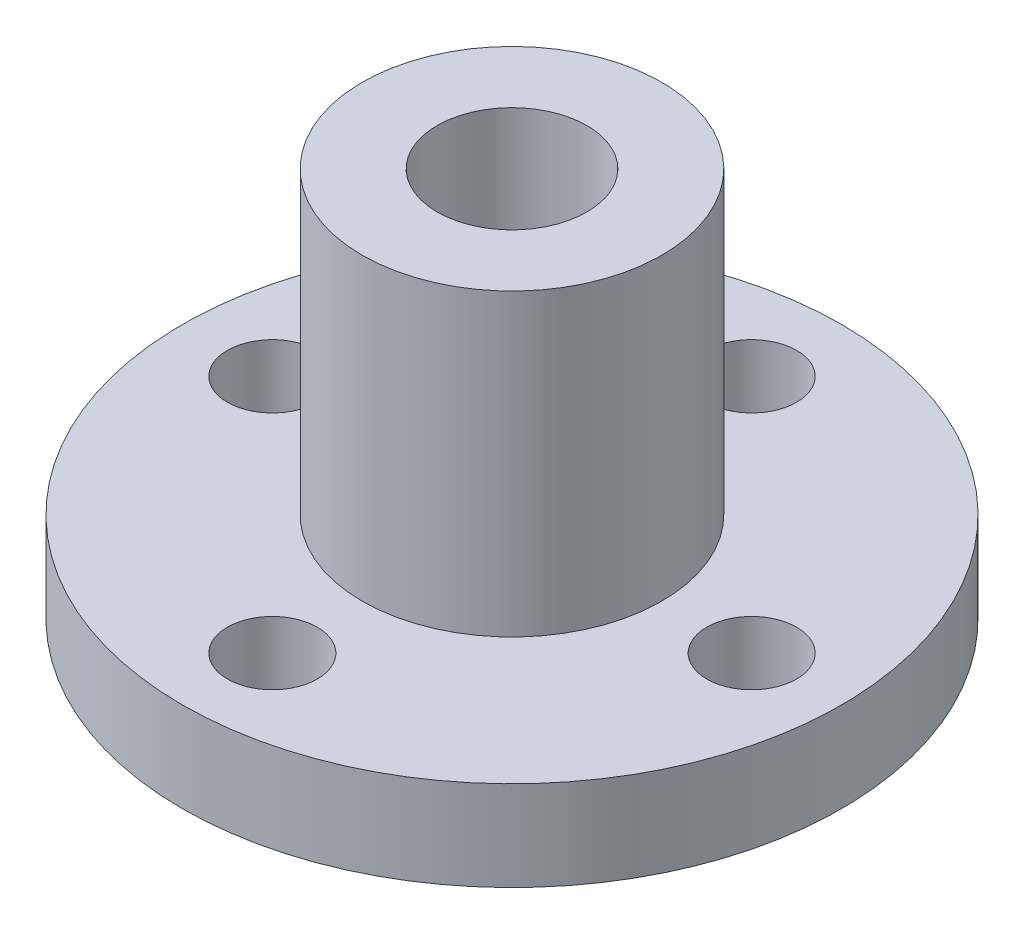
ISO-10303-21;
HEADER;
FILE_DESCRIPTION(('STEP AP214'),'2;1');
FILE_NAME('part.step','',(''),(''),'','','');
FILE_SCHEMA(('AUTOMOTIVE_DESIGN { 1 0 10303 214 1 1 1 1 }'));
ENDSEC;
DATA;
#1=APPLICATION_CONTEXT('core data for automotive mechanical design processes');
#2=APPLICATION_PROTOCOL_DEFINITION('international standard','automotive_design',2000,#1);
#3=PRODUCT_CONTEXT('',#1,'mechanical');
#4=PRODUCT('Part','Part','',(#3));
#5=PRODUCT_RELATED_PRODUCT_CATEGORY('part','',(#4));
#6=PRODUCT_DEFINITION_FORMATION('','',#4);
#7=PRODUCT_DEFINITION_CONTEXT('part definition',#1,'design');
#8=PRODUCT_DEFINITION('design','',#6,#7);
#9=PRODUCT_DEFINITION_SHAPE('','',#8);
#10=(LENGTH_UNIT() NAMED_UNIT(*) SI_UNIT(.MILLI.,.METRE.));
#11=(NAMED_UNIT(*) PLANE_ANGLE_UNIT() SI_UNIT($,.RADIAN.));
#12=(NAMED_UNIT(*) SI_UNIT($,.STERADIAN.) SOLID_ANGLE_UNIT());
#13=UNCERTAINTY_MEASURE_WITH_UNIT(LENGTH_MEASURE(1.E-05),#10,'distance_accuracy_value','');
#14=(GEOMETRIC_REPRESENTATION_CONTEXT(3) GLOBAL_UNCERTAINTY_ASSIGNED_CONTEXT((#13)) GLOBAL_UNIT_ASSIGNED_CONTEXT((#10,
#11,#12)) REPRESENTATION_CONTEXT('',''));
#15=CARTESIAN_POINT('',(0.,0.,0.));
#16=DIRECTION('',(0.,0.,1.));
#17=DIRECTION('',(1.,0.,0.));
#18=AXIS2_PLACEMENT_3D('',#15,#16,#17);
#19=CARTESIAN_POINT('',(0.,3.,0.));
#20=DIRECTION('',(0.,-1.,0.));
#21=DIRECTION('',(0.,0.,-1.));
#22=AXIS2_PLACEMENT_3D('',#19,#20,#21);
#23=CYLINDRICAL_SURFACE('',#22,11.);
#24=CARTESIAN_POINT('',(0.,3.,0.));
#25=DIRECTION('',(0.,1.,0.));
#26=DIRECTION('',(0.,0.,1.));
#27=AXIS2_PLACEMENT_3D('',#24,#25,#26);
#28=CIRCLE('',#27,11.);
#29=CARTESIAN_POINT('',(0.,3.,11.));
#30=VERTEX_POINT('',#29);
#31=EDGE_CURVE('E47',#30,#30,#28,.T.);
#32=ORIENTED_EDGE('',*,*,#31,.F.);
#33=EDGE_LOOP('',(#32));
#34=FACE_BOUND('',#33,.T.);
#35=CARTESIAN_POINT('',(0.,0.,0.));
#36=DIRECTION('',(0.,1.,0.));
#37=DIRECTION('',(0.,0.,1.));
#38=AXIS2_PLACEMENT_3D('',#35,#36,#37);
#39=CIRCLE('',#38,11.);
#40=CARTESIAN_POINT('',(0.,0.,11.));
#41=VERTEX_POINT('',#40);
#42=EDGE_CURVE('E42',#41,#41,#39,.T.);
#43=ORIENTED_EDGE('',*,*,#42,.T.);
#44=EDGE_LOOP('',(#43));
#45=FACE_BOUND('',#44,.T.);
#46=ADVANCED_FACE('F39',(#34,#45),#23,.T.);
#47=CARTESIAN_POINT('',(0.,3.,0.));
#48=DIRECTION('',(0.,1.,0.));
#49=DIRECTION('',(0.,0.,1.));
#50=AXIS2_PLACEMENT_3D('',#47,#48,#49);
#51=PLANE('',#50);
#52=CARTESIAN_POINT('',(-8.,3.,0.));
#53=DIRECTION('',(0.,1.,0.));
#54=DIRECTION('',(0.,0.,1.));
#55=AXIS2_PLACEMENT_3D('',#52,#53,#54);
#56=CIRCLE('',#55,1.5);
#57=CARTESIAN_POINT('',(-8.,3.,1.5));
#58=VERTEX_POINT('',#57);
#59=EDGE_CURVE('E66',#58,#58,#56,.F.);
#60=ORIENTED_EDGE('',*,*,#59,.T.);
#61=EDGE_LOOP('',(#60));
#62=FACE_BOUND('',#61,.T.);
#63=CARTESIAN_POINT('',(0.,3.,8.));
#64=DIRECTION('',(0.,1.,0.));
#65=DIRECTION('',(0.,0.,1.));
#66=AXIS2_PLACEMENT_3D('',#63,#64,#65);
#67=CIRCLE('',#66,1.5);
#68=CARTESIAN_POINT('',(0.,3.,9.5));
#69=VERTEX_POINT('',#68);
#70=EDGE_CURVE('E80',#69,#69,#67,.F.);
#71=ORIENTED_EDGE('',*,*,#70,.T.);
#72=EDGE_LOOP('',(#71));
#73=FACE_BOUND('',#72,.T.);
#74=CARTESIAN_POINT('',(8.,3.,0.));
#75=DIRECTION('',(0.,1.,0.));
#76=DIRECTION('',(0.,0.,1.));
#77=AXIS2_PLACEMENT_3D('',#74,#75,#76);
#78=CIRCLE('',#77,1.5);
#79=CARTESIAN_POINT('',(8.,3.,1.5));
#80=VERTEX_POINT('',#79);
#81=EDGE_CURVE('E71',#80,#80,#78,.F.);
#82=ORIENTED_EDGE('',*,*,#81,.T.);
#83=EDGE_LOOP('',(#82));
#84=FACE_BOUND('',#83,.T.);
#85=CARTESIAN_POINT('',(0.,3.,-8.));
#86=DIRECTION('',(0.,1.,0.));
#87=DIRECTION('',(0.,0.,1.));
#88=AXIS2_PLACEMENT_3D('',#85,#86,#87);
#89=CIRCLE('',#88,1.5);
#90=CARTESIAN_POINT('',(0.,3.,-6.5));
#91=VERTEX_POINT('',#90);
#92=EDGE_CURVE('E72',#91,#91,#89,.F.);
#93=ORIENTED_EDGE('',*,*,#92,.T.);
#94=EDGE_LOOP('',(#93));
#95=FACE_BOUND('',#94,.T.);
#96=CARTESIAN_POINT('',(0.,3.,0.));
#97=DIRECTION('',(0.,1.,0.));
#98=DIRECTION('',(0.,0.,1.));
#99=AXIS2_PLACEMENT_3D('',#96,#97,#98);
#100=CIRCLE('',#99,5.);
#101=CARTESIAN_POINT('',(0.,3.,5.));
#102=VERTEX_POINT('',#101);
#103=EDGE_CURVE('E10',#102,#102,#100,.T.);
#104=ORIENTED_EDGE('',*,*,#103,.F.);
#105=EDGE_LOOP('',(#104));
#106=FACE_BOUND('',#105,.T.);
#107=ORIENTED_EDGE('',*,*,#31,.T.);
#108=EDGE_LOOP('',(#107));
#109=FACE_BOUND('',#108,.T.);
#110=ADVANCED_FACE('F106',(#62,#73,#84,#95,#106,#109),#51,.T.);
#111=CARTESIAN_POINT('',(0.,0.,0.));
#112=DIRECTION('',(0.,1.,0.));
#113=DIRECTION('',(0.,0.,1.));
#114=AXIS2_PLACEMENT_3D('',#111,#112,#113);
#115=PLANE('',#114);
#116=CARTESIAN_POINT('',(-8.,0.,0.));
#117=DIRECTION('',(0.,-1.,0.));
#118=DIRECTION('',(0.,0.,-1.));
#119=AXIS2_PLACEMENT_3D('',#116,#117,#118);
#120=CIRCLE('',#119,1.5);
#121=CARTESIAN_POINT('',(-8.,0.,-1.5));
#122=VERTEX_POINT('',#121);
#123=EDGE_CURVE('E88',#122,#122,#120,.T.);
#124=ORIENTED_EDGE('',*,*,#123,.F.);
#125=EDGE_LOOP('',(#124));
#126=FACE_BOUND('',#125,.T.);
#127=CARTESIAN_POINT('',(0.,0.,8.));
#128=DIRECTION('',(0.,-1.,0.));
#129=DIRECTION('',(0.,0.,-1.));
#130=AXIS2_PLACEMENT_3D('',#127,#128,#129);
#131=CIRCLE('',#130,1.5);
#132=CARTESIAN_POINT('',(0.,0.,6.5));
#133=VERTEX_POINT('',#132);
#134=EDGE_CURVE('E84',#133,#133,#131,.T.);
#135=ORIENTED_EDGE('',*,*,#134,.F.);
#136=EDGE_LOOP('',(#135));
#137=FACE_BOUND('',#136,.T.);
#138=CARTESIAN_POINT('',(8.,0.,0.));
#139=DIRECTION('',(0.,-1.,0.));
#140=DIRECTION('',(0.,0.,-1.));
#141=AXIS2_PLACEMENT_3D('',#138,#139,#140);
#142=CIRCLE('',#141,1.5);
#143=CARTESIAN_POINT('',(8.,0.,-1.5));
#144=VERTEX_POINT('',#143);
#145=EDGE_CURVE('E76',#144,#144,#142,.T.);
#146=ORIENTED_EDGE('',*,*,#145,.F.);
#147=EDGE_LOOP('',(#146));
#148=FACE_BOUND('',#147,.T.);
#149=CARTESIAN_POINT('',(0.,0.,-8.));
#150=DIRECTION('',(0.,-1.,0.));
#151=DIRECTION('',(0.,0.,-1.));
#152=AXIS2_PLACEMENT_3D('',#149,#150,#151);
#153=CIRCLE('',#152,1.5);
#154=CARTESIAN_POINT('',(0.,0.,-9.5));
#155=VERTEX_POINT('',#154);
#156=EDGE_CURVE('E67',#155,#155,#153,.T.);
#157=ORIENTED_EDGE('',*,*,#156,.F.);
#158=EDGE_LOOP('',(#157));
#159=FACE_BOUND('',#158,.T.);
#160=CARTESIAN_POINT('',(0.,0.,0.));
#161=DIRECTION('',(0.,1.,0.));
#162=DIRECTION('',(0.,0.,1.));
#163=AXIS2_PLACEMENT_3D('',#160,#161,#162);
#164=CIRCLE('',#163,2.5);
#165=CARTESIAN_POINT('',(0.,0.,2.5));
#166=VERTEX_POINT('',#165);
#167=EDGE_CURVE('E58',#166,#166,#164,.F.);
#168=ORIENTED_EDGE('',*,*,#167,.F.);
#169=EDGE_LOOP('',(#168));
#170=FACE_BOUND('',#169,.T.);
#171=ORIENTED_EDGE('',*,*,#42,.F.);
#172=EDGE_LOOP('',(#171));
#173=FACE_BOUND('',#172,.T.);
#174=ADVANCED_FACE('F102',(#126,#137,#148,#159,#170,#173),#115,.F.);
#175=CARTESIAN_POINT('',(0.,13.,0.));
#176=DIRECTION('',(0.,-1.,0.));
#177=DIRECTION('',(0.,0.,-1.));
#178=AXIS2_PLACEMENT_3D('',#175,#176,#177);
#179=CYLINDRICAL_SURFACE('',#178,5.);
#180=CARTESIAN_POINT('',(0.,13.,0.));
#181=DIRECTION('',(0.,1.,0.));
#182=DIRECTION('',(0.,0.,1.));
#183=AXIS2_PLACEMENT_3D('',#180,#181,#182);
#184=CIRCLE('',#183,5.);
#185=CARTESIAN_POINT('',(0.,13.,5.));
#186=VERTEX_POINT('',#185);
#187=EDGE_CURVE('E54',#186,#186,#184,.T.);
#188=ORIENTED_EDGE('',*,*,#187,.F.);
#189=EDGE_LOOP('',(#188));
#190=FACE_BOUND('',#189,.T.);
#191=ORIENTED_EDGE('',*,*,#103,.T.);
#192=EDGE_LOOP('',(#191));
#193=FACE_BOUND('',#192,.T.);
#194=ADVANCED_FACE('F105',(#190,#193),#179,.T.);
#195=CARTESIAN_POINT('',(0.,13.,0.));
#196=DIRECTION('',(0.,1.,0.));
#197=DIRECTION('',(0.,0.,1.));
#198=AXIS2_PLACEMENT_3D('',#195,#196,#197);
#199=PLANE('',#198);
#200=CARTESIAN_POINT('',(0.,13.,0.));
#201=DIRECTION('',(0.,1.,0.));
#202=DIRECTION('',(0.,0.,1.));
#203=AXIS2_PLACEMENT_3D('',#200,#201,#202);
#204=CIRCLE('',#203,2.5);
#205=CARTESIAN_POINT('',(0.,13.,2.5));
#206=VERTEX_POINT('',#205);
#207=EDGE_CURVE('E62',#206,#206,#204,.T.);
#208=ORIENTED_EDGE('',*,*,#207,.F.);
#209=EDGE_LOOP('',(#208));
#210=FACE_BOUND('',#209,.T.);
#211=ORIENTED_EDGE('',*,*,#187,.T.);
#212=EDGE_LOOP('',(#211));
#213=FACE_BOUND('',#212,.T.);
#214=ADVANCED_FACE('F134',(#210,#213),#199,.T.);
#215=CARTESIAN_POINT('',(0.,-7.07106781186548,0.));
#216=DIRECTION('',(0.,1.,0.));
#217=DIRECTION('',(0.,0.,1.));
#218=AXIS2_PLACEMENT_3D('',#215,#216,#217);
#219=CYLINDRICAL_SURFACE('',#218,2.5);
#220=ORIENTED_EDGE('',*,*,#167,.T.);
#221=EDGE_LOOP('',(#220));
#222=FACE_BOUND('',#221,.T.);
#223=ORIENTED_EDGE('',*,*,#207,.T.);
#224=EDGE_LOOP('',(#223));
#225=FACE_BOUND('',#224,.T.);
#226=ADVANCED_FACE('F138',(#222,#225),#219,.F.);
#227=CARTESIAN_POINT('',(0.,7.24264068711929,-8.));
#228=DIRECTION('',(0.,-1.,0.));
#229=DIRECTION('',(0.,0.,-1.));
#230=AXIS2_PLACEMENT_3D('',#227,#228,#229);
#231=CYLINDRICAL_SURFACE('',#230,1.5);
#232=ORIENTED_EDGE('',*,*,#156,.T.);
#233=EDGE_LOOP('',(#232));
#234=FACE_BOUND('',#233,.T.);
#235=ORIENTED_EDGE('',*,*,#92,.F.);
#236=EDGE_LOOP('',(#235));
#237=FACE_BOUND('',#236,.T.);
#238=ADVANCED_FACE('F142',(#234,#237),#231,.F.);
#239=CARTESIAN_POINT('',(8.,7.24264068711929,0.));
#240=DIRECTION('',(0.,-1.,0.));
#241=DIRECTION('',(0.,0.,-1.));
#242=AXIS2_PLACEMENT_3D('',#239,#240,#241);
#243=CYLINDRICAL_SURFACE('',#242,1.5);
#244=ORIENTED_EDGE('',*,*,#145,.T.);
#245=EDGE_LOOP('',(#244));
#246=FACE_BOUND('',#245,.T.);
#247=ORIENTED_EDGE('',*,*,#81,.F.);
#248=EDGE_LOOP('',(#247));
#249=FACE_BOUND('',#248,.T.);
#250=ADVANCED_FACE('F146',(#246,#249),#243,.F.);
#251=CARTESIAN_POINT('',(0.,7.24264068711929,8.));
#252=DIRECTION('',(0.,-1.,0.));
#253=DIRECTION('',(0.,0.,-1.));
#254=AXIS2_PLACEMENT_3D('',#251,#252,#253);
#255=CYLINDRICAL_SURFACE('',#254,1.5);
#256=ORIENTED_EDGE('',*,*,#134,.T.);
#257=EDGE_LOOP('',(#256));
#258=FACE_BOUND('',#257,.T.);
#259=ORIENTED_EDGE('',*,*,#70,.F.);
#260=EDGE_LOOP('',(#259));
#261=FACE_BOUND('',#260,.T.);
#262=ADVANCED_FACE('F150',(#258,#261),#255,.F.);
#263=CARTESIAN_POINT('',(-8.,7.24264068711929,0.));
#264=DIRECTION('',(0.,-1.,0.));
#265=DIRECTION('',(0.,0.,-1.));
#266=AXIS2_PLACEMENT_3D('',#263,#264,#265);
#267=CYLINDRICAL_SURFACE('',#266,1.5);
#268=ORIENTED_EDGE('',*,*,#123,.T.);
#269=EDGE_LOOP('',(#268));
#270=FACE_BOUND('',#269,.T.);
#271=ORIENTED_EDGE('',*,*,#59,.F.);
#272=EDGE_LOOP('',(#271));
#273=FACE_BOUND('',#272,.T.);
#274=ADVANCED_FACE('F99',(#270,#273),#267,.F.);
#275=CLOSED_SHELL('',(#46,#110,#174,#194,#214,#226,#238,#250,#262,#274));
#276=MANIFOLD_SOLID_BREP('B2',#275);
#277=ADVANCED_BREP_SHAPE_REPRESENTATION('',(#18,#276),#14);
#278=SHAPE_DEFINITION_REPRESENTATION(#9,#277);
ENDSEC;
END-ISO-10303-21;
